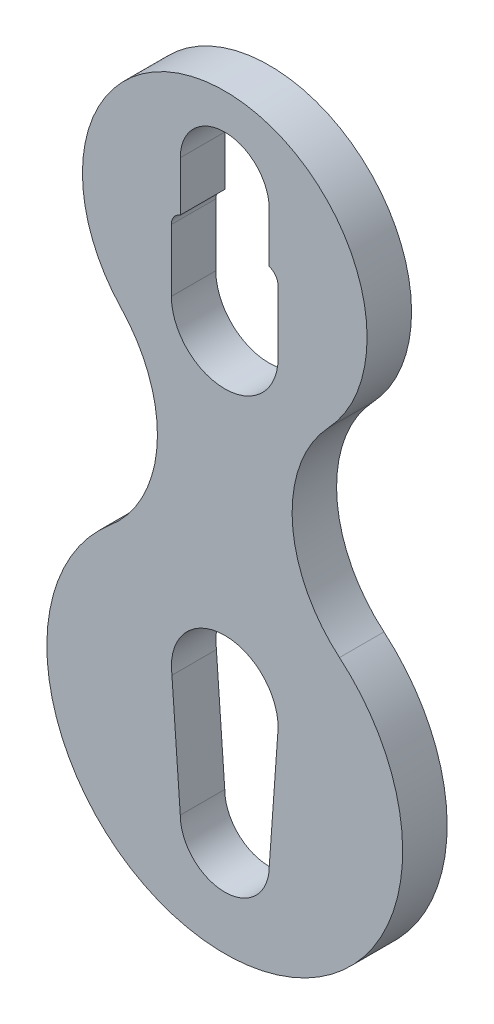
ISO-10303-21;
HEADER;
FILE_DESCRIPTION(('STEP AP214'),'2;1');
FILE_NAME('part.step','',(''),(''),'','','');
FILE_SCHEMA(('AUTOMOTIVE_DESIGN { 1 0 10303 214 1 1 1 1 }'));
ENDSEC;
DATA;
#1=APPLICATION_CONTEXT('core data for automotive mechanical design processes');
#2=APPLICATION_PROTOCOL_DEFINITION('international standard','automotive_design',2000,#1);
#3=PRODUCT_CONTEXT('',#1,'mechanical');
#4=PRODUCT('Part','Part','',(#3));
#5=PRODUCT_RELATED_PRODUCT_CATEGORY('part','',(#4));
#6=PRODUCT_DEFINITION_FORMATION('','',#4);
#7=PRODUCT_DEFINITION_CONTEXT('part definition',#1,'design');
#8=PRODUCT_DEFINITION('design','',#6,#7);
#9=PRODUCT_DEFINITION_SHAPE('','',#8);
#10=(LENGTH_UNIT() NAMED_UNIT(*) SI_UNIT(.MILLI.,.METRE.));
#11=(NAMED_UNIT(*) PLANE_ANGLE_UNIT() SI_UNIT($,.RADIAN.));
#12=(NAMED_UNIT(*) SI_UNIT($,.STERADIAN.) SOLID_ANGLE_UNIT());
#13=UNCERTAINTY_MEASURE_WITH_UNIT(LENGTH_MEASURE(1.E-05),#10,'distance_accuracy_value','');
#14=(GEOMETRIC_REPRESENTATION_CONTEXT(3) GLOBAL_UNCERTAINTY_ASSIGNED_CONTEXT((#13)) GLOBAL_UNIT_ASSIGNED_CONTEXT((#10,
#11,#12)) REPRESENTATION_CONTEXT('',''));
#15=CARTESIAN_POINT('',(0.,0.,0.));
#16=DIRECTION('',(0.,0.,1.));
#17=DIRECTION('',(1.,0.,0.));
#18=AXIS2_PLACEMENT_3D('',#15,#16,#17);
#19=CARTESIAN_POINT('',(0.,-18.,5.));
#20=DIRECTION('',(0.,0.,-1.));
#21=DIRECTION('',(-1.,0.,0.));
#22=AXIS2_PLACEMENT_3D('',#19,#20,#21);
#23=CYLINDRICAL_SURFACE('',#22,10.);
#24=CARTESIAN_POINT('',(0.,-18.,-5.));
#25=DIRECTION('',(0.,0.,1.));
#26=DIRECTION('',(1.,0.,0.));
#27=AXIS2_PLACEMENT_3D('',#24,#25,#26);
#28=CIRCLE('',#27,10.);
#29=CARTESIAN_POINT('',(-10.,-18.,-5.));
#30=VERTEX_POINT('',#29);
#31=CARTESIAN_POINT('',(10.,-18.,-5.));
#32=VERTEX_POINT('',#31);
#33=EDGE_CURVE('E239',#30,#32,#28,.T.);
#34=ORIENTED_EDGE('',*,*,#33,.F.);
#35=DIRECTION('',(0.,0.,-1.));
#36=VECTOR('',#35,1.);
#37=CARTESIAN_POINT('',(-10.,-18.,5.));
#38=LINE('',#37,#36);
#39=CARTESIAN_POINT('',(-10.,-18.,5.));
#40=VERTEX_POINT('',#39);
#41=EDGE_CURVE('E11',#40,#30,#38,.T.);
#42=ORIENTED_EDGE('',*,*,#41,.F.);
#43=CARTESIAN_POINT('',(0.,-18.,5.));
#44=DIRECTION('',(0.,0.,1.));
#45=DIRECTION('',(1.,0.,0.));
#46=AXIS2_PLACEMENT_3D('',#43,#44,#45);
#47=CIRCLE('',#46,10.);
#48=CARTESIAN_POINT('',(10.,-18.,5.));
#49=VERTEX_POINT('',#48);
#50=EDGE_CURVE('E182',#40,#49,#47,.T.);
#51=ORIENTED_EDGE('',*,*,#50,.T.);
#52=DIRECTION('',(0.,0.,-1.));
#53=VECTOR('',#52,1.);
#54=CARTESIAN_POINT('',(10.,-18.,5.));
#55=LINE('',#54,#53);
#56=EDGE_CURVE('E121',#49,#32,#55,.T.);
#57=ORIENTED_EDGE('',*,*,#56,.T.);
#58=EDGE_LOOP('',(#34,#42,#51,#57));
#59=FACE_BOUND('',#58,.T.);
#60=ADVANCED_FACE('F43',(#59),#23,.F.);
#61=CARTESIAN_POINT('',(-11.2284263959391,-0.802030456852792,5.));
#62=DIRECTION('',(0.997458699830735,0.0712470499879096,0.));
#63=DIRECTION('',(-0.0712470499879096,0.997458699830735,0.));
#64=AXIS2_PLACEMENT_3D('',#61,#62,#63);
#65=PLANE('',#64);
#66=DIRECTION('',(0.0712470499879096,-0.997458699830735,0.));
#67=VECTOR('',#66,1.);
#68=CARTESIAN_POINT('',(-11.2284263959391,-0.802030456852792,-5.));
#69=LINE('',#68,#67);
#70=CARTESIAN_POINT('',(-11.8781725888325,8.29441624365486,-5.));
#71=VERTEX_POINT('',#70);
#72=EDGE_CURVE('E173',#71,#30,#69,.T.);
#73=ORIENTED_EDGE('',*,*,#72,.F.);
#74=DIRECTION('',(0.,0.,-1.));
#75=VECTOR('',#74,1.);
#76=CARTESIAN_POINT('',(-11.8781725888325,8.29441624365486,5.));
#77=LINE('',#76,#75);
#78=CARTESIAN_POINT('',(-11.8781725888325,8.29441624365486,5.));
#79=VERTEX_POINT('',#78);
#80=EDGE_CURVE('E54',#79,#71,#77,.T.);
#81=ORIENTED_EDGE('',*,*,#80,.F.);
#82=DIRECTION('',(0.0712470499879096,-0.997458699830735,0.));
#83=VECTOR('',#82,1.);
#84=CARTESIAN_POINT('',(-11.2284263959391,-0.802030456852792,5.));
#85=LINE('',#84,#83);
#86=EDGE_CURVE('E171',#79,#40,#85,.T.);
#87=ORIENTED_EDGE('',*,*,#86,.T.);
#88=ORIENTED_EDGE('',*,*,#41,.T.);
#89=EDGE_LOOP('',(#73,#81,#87,#88));
#90=FACE_BOUND('',#89,.T.);
#91=ADVANCED_FACE('F170',(#90),#65,.T.);
#92=CARTESIAN_POINT('',(0.,10.,5.));
#93=DIRECTION('',(0.,0.,-1.));
#94=DIRECTION('',(-1.,0.,0.));
#95=AXIS2_PLACEMENT_3D('',#92,#93,#94);
#96=CYLINDRICAL_SURFACE('',#95,12.);
#97=CARTESIAN_POINT('',(0.,10.,-5.));
#98=DIRECTION('',(0.,0.,1.));
#99=DIRECTION('',(1.,0.,0.));
#100=AXIS2_PLACEMENT_3D('',#97,#98,#99);
#101=CIRCLE('',#100,12.);
#102=CARTESIAN_POINT('',(11.8781725888325,8.29441624365486,-5.));
#103=VERTEX_POINT('',#102);
#104=EDGE_CURVE('E245',#103,#71,#101,.T.);
#105=ORIENTED_EDGE('',*,*,#104,.F.);
#106=DIRECTION('',(0.,0.,-1.));
#107=VECTOR('',#106,1.);
#108=CARTESIAN_POINT('',(11.8781725888325,8.29441624365486,5.));
#109=LINE('',#108,#107);
#110=CARTESIAN_POINT('',(11.8781725888325,8.29441624365486,5.));
#111=VERTEX_POINT('',#110);
#112=EDGE_CURVE('E114',#111,#103,#109,.T.);
#113=ORIENTED_EDGE('',*,*,#112,.F.);
#114=CARTESIAN_POINT('',(0.,10.,5.));
#115=DIRECTION('',(0.,0.,1.));
#116=DIRECTION('',(1.,0.,0.));
#117=AXIS2_PLACEMENT_3D('',#114,#115,#116);
#118=CIRCLE('',#117,12.);
#119=EDGE_CURVE('E181',#111,#79,#118,.T.);
#120=ORIENTED_EDGE('',*,*,#119,.T.);
#121=ORIENTED_EDGE('',*,*,#80,.T.);
#122=EDGE_LOOP('',(#105,#113,#120,#121));
#123=FACE_BOUND('',#122,.T.);
#124=ADVANCED_FACE('F185',(#123),#96,.F.);
#125=CARTESIAN_POINT('',(9.99999999999998,0.,5.));
#126=DIRECTION('',(1.,0.,0.));
#127=DIRECTION('',(0.,1.,0.));
#128=AXIS2_PLACEMENT_3D('',#125,#126,#127);
#129=PLANE('',#128);
#130=DIRECTION('',(0.,-1.,0.));
#131=VECTOR('',#130,1.);
#132=CARTESIAN_POINT('',(9.99999999999998,0.,-5.));
#133=LINE('',#132,#131);
#134=CARTESIAN_POINT('',(10.,110.,-5.));
#135=VERTEX_POINT('',#134);
#136=CARTESIAN_POINT('',(10.,98.8284271247462,-5.));
#137=VERTEX_POINT('',#136);
#138=EDGE_CURVE('E208',#135,#137,#133,.T.);
#139=ORIENTED_EDGE('',*,*,#138,.T.);
#140=DIRECTION('',(0.,0.,-1.));
#141=VECTOR('',#140,1.);
#142=CARTESIAN_POINT('',(10.,98.8284271247462,5.));
#143=LINE('',#142,#141);
#144=CARTESIAN_POINT('',(10.,98.8284271247462,5.));
#145=VERTEX_POINT('',#144);
#146=EDGE_CURVE('E254',#145,#137,#143,.T.);
#147=ORIENTED_EDGE('',*,*,#146,.F.);
#148=DIRECTION('',(0.,-1.,0.));
#149=VECTOR('',#148,1.);
#150=CARTESIAN_POINT('',(9.99999999999998,0.,5.));
#151=LINE('',#150,#149);
#152=CARTESIAN_POINT('',(10.,110.,5.));
#153=VERTEX_POINT('',#152);
#154=EDGE_CURVE('E540',#153,#145,#151,.T.);
#155=ORIENTED_EDGE('',*,*,#154,.F.);
#156=DIRECTION('',(0.,0.,-1.));
#157=VECTOR('',#156,1.);
#158=CARTESIAN_POINT('',(10.,110.,5.));
#159=LINE('',#158,#157);
#160=EDGE_CURVE('E257',#153,#135,#159,.T.);
#161=ORIENTED_EDGE('',*,*,#160,.T.);
#162=EDGE_LOOP('',(#139,#147,#155,#161));
#163=FACE_BOUND('',#162,.T.);
#164=ADVANCED_FACE('F350',(#163),#129,.F.);
#165=CARTESIAN_POINT('',(9.,96.,5.));
#166=DIRECTION('',(0.,0.,-1.));
#167=DIRECTION('',(-1.,0.,0.));
#168=AXIS2_PLACEMENT_3D('',#165,#166,#167);
#169=CYLINDRICAL_SURFACE('',#168,3.);
#170=CARTESIAN_POINT('',(9.,96.,-5.));
#171=DIRECTION('',(0.,0.,1.));
#172=DIRECTION('',(1.,0.,0.));
#173=AXIS2_PLACEMENT_3D('',#170,#171,#172);
#174=CIRCLE('',#173,3.);
#175=CARTESIAN_POINT('',(12.,96.,-5.));
#176=VERTEX_POINT('',#175);
#177=EDGE_CURVE('E212',#137,#176,#174,.F.);
#178=ORIENTED_EDGE('',*,*,#177,.T.);
#179=DIRECTION('',(0.,0.,-1.));
#180=VECTOR('',#179,1.);
#181=CARTESIAN_POINT('',(12.,96.,5.));
#182=LINE('',#181,#180);
#183=CARTESIAN_POINT('',(12.,96.,5.));
#184=VERTEX_POINT('',#183);
#185=EDGE_CURVE('E275',#184,#176,#182,.T.);
#186=ORIENTED_EDGE('',*,*,#185,.F.);
#187=CARTESIAN_POINT('',(9.,96.,5.));
#188=DIRECTION('',(0.,0.,1.));
#189=DIRECTION('',(1.,0.,0.));
#190=AXIS2_PLACEMENT_3D('',#187,#188,#189);
#191=CIRCLE('',#190,3.);
#192=EDGE_CURVE('E537',#145,#184,#191,.F.);
#193=ORIENTED_EDGE('',*,*,#192,.F.);
#194=ORIENTED_EDGE('',*,*,#146,.T.);
#195=EDGE_LOOP('',(#178,#186,#193,#194));
#196=FACE_BOUND('',#195,.T.);
#197=ADVANCED_FACE('F346',(#196),#169,.F.);
#198=CARTESIAN_POINT('',(12.,0.,5.));
#199=DIRECTION('',(1.,0.,0.));
#200=DIRECTION('',(0.,1.,0.));
#201=AXIS2_PLACEMENT_3D('',#198,#199,#200);
#202=PLANE('',#201);
#203=DIRECTION('',(0.,-1.,0.));
#204=VECTOR('',#203,1.);
#205=CARTESIAN_POINT('',(12.,0.,-5.));
#206=LINE('',#205,#204);
#207=CARTESIAN_POINT('',(12.,82.,-5.));
#208=VERTEX_POINT('',#207);
#209=EDGE_CURVE('E215',#176,#208,#206,.T.);
#210=ORIENTED_EDGE('',*,*,#209,.T.);
#211=DIRECTION('',(0.,0.,-1.));
#212=VECTOR('',#211,1.);
#213=CARTESIAN_POINT('',(12.,82.,5.));
#214=LINE('',#213,#212);
#215=CARTESIAN_POINT('',(12.,82.,5.));
#216=VERTEX_POINT('',#215);
#217=EDGE_CURVE('E272',#216,#208,#214,.T.);
#218=ORIENTED_EDGE('',*,*,#217,.F.);
#219=DIRECTION('',(0.,-1.,0.));
#220=VECTOR('',#219,1.);
#221=CARTESIAN_POINT('',(12.,0.,5.));
#222=LINE('',#221,#220);
#223=EDGE_CURVE('E534',#184,#216,#222,.T.);
#224=ORIENTED_EDGE('',*,*,#223,.F.);
#225=ORIENTED_EDGE('',*,*,#185,.T.);
#226=EDGE_LOOP('',(#210,#218,#224,#225));
#227=FACE_BOUND('',#226,.T.);
#228=ADVANCED_FACE('F342',(#227),#202,.F.);
#229=CARTESIAN_POINT('',(0.,82.,5.));
#230=DIRECTION('',(0.,0.,-1.));
#231=DIRECTION('',(-1.,0.,0.));
#232=AXIS2_PLACEMENT_3D('',#229,#230,#231);
#233=CYLINDRICAL_SURFACE('',#232,12.);
#234=CARTESIAN_POINT('',(0.,82.,-5.));
#235=DIRECTION('',(0.,0.,1.));
#236=DIRECTION('',(1.,0.,0.));
#237=AXIS2_PLACEMENT_3D('',#234,#235,#236);
#238=CIRCLE('',#237,12.);
#239=CARTESIAN_POINT('',(-12.,82.,-5.));
#240=VERTEX_POINT('',#239);
#241=EDGE_CURVE('E219',#240,#208,#238,.T.);
#242=ORIENTED_EDGE('',*,*,#241,.F.);
#243=DIRECTION('',(0.,0.,-1.));
#244=VECTOR('',#243,1.);
#245=CARTESIAN_POINT('',(-12.,82.,5.));
#246=LINE('',#245,#244);
#247=CARTESIAN_POINT('',(-12.,82.,5.));
#248=VERTEX_POINT('',#247);
#249=EDGE_CURVE('E269',#248,#240,#246,.T.);
#250=ORIENTED_EDGE('',*,*,#249,.F.);
#251=CARTESIAN_POINT('',(0.,82.,5.));
#252=DIRECTION('',(0.,0.,1.));
#253=DIRECTION('',(1.,0.,0.));
#254=AXIS2_PLACEMENT_3D('',#251,#252,#253);
#255=CIRCLE('',#254,12.);
#256=EDGE_CURVE('E530',#248,#216,#255,.T.);
#257=ORIENTED_EDGE('',*,*,#256,.T.);
#258=ORIENTED_EDGE('',*,*,#217,.T.);
#259=EDGE_LOOP('',(#242,#250,#257,#258));
#260=FACE_BOUND('',#259,.T.);
#261=ADVANCED_FACE('F338',(#260),#233,.F.);
#262=CARTESIAN_POINT('',(-12.,0.,5.));
#263=DIRECTION('',(1.,0.,0.));
#264=DIRECTION('',(0.,1.,0.));
#265=AXIS2_PLACEMENT_3D('',#262,#263,#264);
#266=PLANE('',#265);
#267=DIRECTION('',(0.,-1.,0.));
#268=VECTOR('',#267,1.);
#269=CARTESIAN_POINT('',(-12.,0.,-5.));
#270=LINE('',#269,#268);
#271=CARTESIAN_POINT('',(-12.,96.,-5.));
#272=VERTEX_POINT('',#271);
#273=EDGE_CURVE('E223',#272,#240,#270,.T.);
#274=ORIENTED_EDGE('',*,*,#273,.F.);
#275=DIRECTION('',(0.,0.,-1.));
#276=VECTOR('',#275,1.);
#277=CARTESIAN_POINT('',(-12.,96.,5.));
#278=LINE('',#277,#276);
#279=CARTESIAN_POINT('',(-12.,96.,5.));
#280=VERTEX_POINT('',#279);
#281=EDGE_CURVE('E266',#280,#272,#278,.T.);
#282=ORIENTED_EDGE('',*,*,#281,.F.);
#283=DIRECTION('',(0.,-1.,0.));
#284=VECTOR('',#283,1.);
#285=CARTESIAN_POINT('',(-12.,0.,5.));
#286=LINE('',#285,#284);
#287=EDGE_CURVE('E526',#280,#248,#286,.T.);
#288=ORIENTED_EDGE('',*,*,#287,.T.);
#289=ORIENTED_EDGE('',*,*,#249,.T.);
#290=EDGE_LOOP('',(#274,#282,#288,#289));
#291=FACE_BOUND('',#290,.T.);
#292=ADVANCED_FACE('F334',(#291),#266,.T.);
#293=CARTESIAN_POINT('',(-9.,96.,5.));
#294=DIRECTION('',(0.,0.,-1.));
#295=DIRECTION('',(-1.,0.,0.));
#296=AXIS2_PLACEMENT_3D('',#293,#294,#295);
#297=CYLINDRICAL_SURFACE('',#296,3.);
#298=CARTESIAN_POINT('',(-9.,96.,-5.));
#299=DIRECTION('',(0.,0.,1.));
#300=DIRECTION('',(1.,0.,0.));
#301=AXIS2_PLACEMENT_3D('',#298,#299,#300);
#302=CIRCLE('',#301,3.);
#303=CARTESIAN_POINT('',(-10.,98.8284271247462,-5.));
#304=VERTEX_POINT('',#303);
#305=EDGE_CURVE('E227',#304,#272,#302,.T.);
#306=ORIENTED_EDGE('',*,*,#305,.F.);
#307=DIRECTION('',(0.,0.,-1.));
#308=VECTOR('',#307,1.);
#309=CARTESIAN_POINT('',(-10.,98.8284271247462,5.));
#310=LINE('',#309,#308);
#311=CARTESIAN_POINT('',(-10.,98.8284271247462,5.));
#312=VERTEX_POINT('',#311);
#313=EDGE_CURVE('E263',#312,#304,#310,.T.);
#314=ORIENTED_EDGE('',*,*,#313,.F.);
#315=CARTESIAN_POINT('',(-9.,96.,5.));
#316=DIRECTION('',(0.,0.,1.));
#317=DIRECTION('',(1.,0.,0.));
#318=AXIS2_PLACEMENT_3D('',#315,#316,#317);
#319=CIRCLE('',#318,3.);
#320=EDGE_CURVE('E522',#312,#280,#319,.T.);
#321=ORIENTED_EDGE('',*,*,#320,.T.);
#322=ORIENTED_EDGE('',*,*,#281,.T.);
#323=EDGE_LOOP('',(#306,#314,#321,#322));
#324=FACE_BOUND('',#323,.T.);
#325=ADVANCED_FACE('F330',(#324),#297,.F.);
#326=CARTESIAN_POINT('',(-9.99999999999998,0.,5.));
#327=DIRECTION('',(1.,0.,0.));
#328=DIRECTION('',(0.,1.,0.));
#329=AXIS2_PLACEMENT_3D('',#326,#327,#328);
#330=PLANE('',#329);
#331=DIRECTION('',(0.,-1.,0.));
#332=VECTOR('',#331,1.);
#333=CARTESIAN_POINT('',(-9.99999999999998,0.,-5.));
#334=LINE('',#333,#332);
#335=CARTESIAN_POINT('',(-10.,110.,-5.));
#336=VERTEX_POINT('',#335);
#337=EDGE_CURVE('E231',#336,#304,#334,.T.);
#338=ORIENTED_EDGE('',*,*,#337,.F.);
#339=DIRECTION('',(0.,0.,-1.));
#340=VECTOR('',#339,1.);
#341=CARTESIAN_POINT('',(-10.,110.,5.));
#342=LINE('',#341,#340);
#343=CARTESIAN_POINT('',(-10.,110.,5.));
#344=VERTEX_POINT('',#343);
#345=EDGE_CURVE('E260',#344,#336,#342,.T.);
#346=ORIENTED_EDGE('',*,*,#345,.F.);
#347=DIRECTION('',(0.,-1.,0.));
#348=VECTOR('',#347,1.);
#349=CARTESIAN_POINT('',(-9.99999999999998,0.,5.));
#350=LINE('',#349,#348);
#351=EDGE_CURVE('E516',#344,#312,#350,.T.);
#352=ORIENTED_EDGE('',*,*,#351,.T.);
#353=ORIENTED_EDGE('',*,*,#313,.T.);
#354=EDGE_LOOP('',(#338,#346,#352,#353));
#355=FACE_BOUND('',#354,.T.);
#356=ADVANCED_FACE('F327',(#355),#330,.T.);
#357=CARTESIAN_POINT('',(0.,96.,5.));
#358=DIRECTION('',(0.,0.,-1.));
#359=DIRECTION('',(-1.,0.,0.));
#360=AXIS2_PLACEMENT_3D('',#357,#358,#359);
#361=CYLINDRICAL_SURFACE('',#360,32.);
#362=CARTESIAN_POINT('',(0.,96.,-5.));
#363=DIRECTION('',(0.,0.,1.));
#364=DIRECTION('',(1.,0.,0.));
#365=AXIS2_PLACEMENT_3D('',#362,#363,#364);
#366=CIRCLE('',#365,32.);
#367=CARTESIAN_POINT('',(23.2988099985067,74.0645161290323,-5.));
#368=VERTEX_POINT('',#367);
#369=CARTESIAN_POINT('',(-23.2988099985067,74.0645161290323,-5.));
#370=VERTEX_POINT('',#369);
#371=EDGE_CURVE('E193',#368,#370,#366,.T.);
#372=ORIENTED_EDGE('',*,*,#371,.T.);
#373=DIRECTION('',(0.,0.,-1.));
#374=VECTOR('',#373,1.);
#375=CARTESIAN_POINT('',(-23.2988099985067,74.0645161290323,5.));
#376=LINE('',#375,#374);
#377=CARTESIAN_POINT('',(-23.2988099985067,74.0645161290323,5.));
#378=VERTEX_POINT('',#377);
#379=EDGE_CURVE('E47',#378,#370,#376,.T.);
#380=ORIENTED_EDGE('',*,*,#379,.F.);
#381=CARTESIAN_POINT('',(0.,96.,5.));
#382=DIRECTION('',(0.,0.,1.));
#383=DIRECTION('',(1.,0.,0.));
#384=AXIS2_PLACEMENT_3D('',#381,#382,#383);
#385=CIRCLE('',#384,32.);
#386=CARTESIAN_POINT('',(23.2988099985067,74.0645161290323,5.));
#387=VERTEX_POINT('',#386);
#388=EDGE_CURVE('E251',#387,#378,#385,.T.);
#389=ORIENTED_EDGE('',*,*,#388,.F.);
#390=DIRECTION('',(0.,0.,-1.));
#391=VECTOR('',#390,1.);
#392=CARTESIAN_POINT('',(23.2988099985067,74.0645161290323,5.));
#393=LINE('',#392,#391);
#394=EDGE_CURVE('E189',#387,#368,#393,.T.);
#395=ORIENTED_EDGE('',*,*,#394,.T.);
#396=EDGE_LOOP('',(#372,#380,#389,#395));
#397=FACE_BOUND('',#396,.T.);
#398=ADVANCED_FACE('F45',(#397),#361,.T.);
#399=CARTESIAN_POINT('',(-45.1414443721067,53.5,5.));
#400=DIRECTION('',(0.,0.,-1.));
#401=DIRECTION('',(-1.,0.,0.));
#402=AXIS2_PLACEMENT_3D('',#399,#400,#401);
#403=CYLINDRICAL_SURFACE('',#402,30.);
#404=CARTESIAN_POINT('',(-45.1414443721067,53.5,-5.));
#405=DIRECTION('',(0.,0.,1.));
#406=DIRECTION('',(1.,0.,0.));
#407=AXIS2_PLACEMENT_3D('',#404,#405,#406);
#408=CIRCLE('',#407,30.);
#409=CARTESIAN_POINT('',(-25.7951110697752,30.5714285714286,-5.));
#410=VERTEX_POINT('',#409);
#411=EDGE_CURVE('E197',#370,#410,#408,.F.);
#412=ORIENTED_EDGE('',*,*,#411,.T.);
#413=DIRECTION('',(0.,0.,-1.));
#414=VECTOR('',#413,1.);
#415=CARTESIAN_POINT('',(-25.7951110697752,30.5714285714286,5.));
#416=LINE('',#415,#414);
#417=CARTESIAN_POINT('',(-25.7951110697752,30.5714285714286,5.));
#418=VERTEX_POINT('',#417);
#419=EDGE_CURVE('E286',#418,#410,#416,.T.);
#420=ORIENTED_EDGE('',*,*,#419,.F.);
#421=CARTESIAN_POINT('',(-45.1414443721067,53.5,5.));
#422=DIRECTION('',(0.,0.,1.));
#423=DIRECTION('',(1.,0.,0.));
#424=AXIS2_PLACEMENT_3D('',#421,#422,#423);
#425=CIRCLE('',#424,30.);
#426=EDGE_CURVE('E129',#378,#418,#425,.F.);
#427=ORIENTED_EDGE('',*,*,#426,.F.);
#428=ORIENTED_EDGE('',*,*,#379,.T.);
#429=EDGE_LOOP('',(#412,#420,#427,#428));
#430=FACE_BOUND('',#429,.T.);
#431=ADVANCED_FACE('F294',(#430),#403,.F.);
#432=CARTESIAN_POINT('',(0.,0.,5.));
#433=DIRECTION('',(0.,0.,-1.));
#434=DIRECTION('',(-1.,0.,0.));
#435=AXIS2_PLACEMENT_3D('',#432,#433,#434);
#436=CYLINDRICAL_SURFACE('',#435,40.);
#437=CARTESIAN_POINT('',(0.,0.,-5.));
#438=DIRECTION('',(0.,0.,1.));
#439=DIRECTION('',(1.,0.,0.));
#440=AXIS2_PLACEMENT_3D('',#437,#438,#439);
#441=CIRCLE('',#440,40.);
#442=CARTESIAN_POINT('',(25.7951110697752,30.5714285714286,-5.));
#443=VERTEX_POINT('',#442);
#444=EDGE_CURVE('E200',#410,#443,#441,.T.);
#445=ORIENTED_EDGE('',*,*,#444,.T.);
#446=DIRECTION('',(0.,0.,-1.));
#447=VECTOR('',#446,1.);
#448=CARTESIAN_POINT('',(25.7951110697752,30.5714285714286,5.));
#449=LINE('',#448,#447);
#450=CARTESIAN_POINT('',(25.7951110697752,30.5714285714286,5.));
#451=VERTEX_POINT('',#450);
#452=EDGE_CURVE('E284',#451,#443,#449,.T.);
#453=ORIENTED_EDGE('',*,*,#452,.F.);
#454=CARTESIAN_POINT('',(0.,0.,5.));
#455=DIRECTION('',(0.,0.,1.));
#456=DIRECTION('',(1.,0.,0.));
#457=AXIS2_PLACEMENT_3D('',#454,#455,#456);
#458=CIRCLE('',#457,40.);
#459=EDGE_CURVE('E546',#418,#451,#458,.T.);
#460=ORIENTED_EDGE('',*,*,#459,.F.);
#461=ORIENTED_EDGE('',*,*,#419,.T.);
#462=EDGE_LOOP('',(#445,#453,#460,#461));
#463=FACE_BOUND('',#462,.T.);
#464=ADVANCED_FACE('F308',(#463),#436,.T.);
#465=CARTESIAN_POINT('',(0.,110.,5.));
#466=DIRECTION('',(0.,0.,-1.));
#467=DIRECTION('',(-1.,0.,0.));
#468=AXIS2_PLACEMENT_3D('',#465,#466,#467);
#469=CYLINDRICAL_SURFACE('',#468,10.);
#470=CARTESIAN_POINT('',(0.,110.,-5.));
#471=DIRECTION('',(0.,0.,1.));
#472=DIRECTION('',(1.,0.,0.));
#473=AXIS2_PLACEMENT_3D('',#470,#471,#472);
#474=CIRCLE('',#473,10.);
#475=EDGE_CURVE('E235',#135,#336,#474,.T.);
#476=ORIENTED_EDGE('',*,*,#475,.F.);
#477=ORIENTED_EDGE('',*,*,#160,.F.);
#478=CARTESIAN_POINT('',(0.,110.,5.));
#479=DIRECTION('',(0.,0.,1.));
#480=DIRECTION('',(1.,0.,0.));
#481=AXIS2_PLACEMENT_3D('',#478,#479,#480);
#482=CIRCLE('',#481,10.);
#483=EDGE_CURVE('E513',#153,#344,#482,.T.);
#484=ORIENTED_EDGE('',*,*,#483,.T.);
#485=ORIENTED_EDGE('',*,*,#345,.T.);
#486=EDGE_LOOP('',(#476,#477,#484,#485));
#487=FACE_BOUND('',#486,.T.);
#488=ADVANCED_FACE('F310',(#487),#469,.F.);
#489=CARTESIAN_POINT('',(45.1414443721067,53.5,5.));
#490=DIRECTION('',(0.,0.,-1.));
#491=DIRECTION('',(-1.,0.,0.));
#492=AXIS2_PLACEMENT_3D('',#489,#490,#491);
#493=CYLINDRICAL_SURFACE('',#492,30.);
#494=CARTESIAN_POINT('',(45.1414443721067,53.5,-5.));
#495=DIRECTION('',(0.,0.,1.));
#496=DIRECTION('',(1.,0.,0.));
#497=AXIS2_PLACEMENT_3D('',#494,#495,#496);
#498=CIRCLE('',#497,30.);
#499=EDGE_CURVE('E204',#368,#443,#498,.T.);
#500=ORIENTED_EDGE('',*,*,#499,.F.);
#501=ORIENTED_EDGE('',*,*,#394,.F.);
#502=CARTESIAN_POINT('',(45.1414443721067,53.5,5.));
#503=DIRECTION('',(0.,0.,1.));
#504=DIRECTION('',(1.,0.,0.));
#505=AXIS2_PLACEMENT_3D('',#502,#503,#504);
#506=CIRCLE('',#505,30.);
#507=EDGE_CURVE('E307',#387,#451,#506,.T.);
#508=ORIENTED_EDGE('',*,*,#507,.T.);
#509=ORIENTED_EDGE('',*,*,#452,.T.);
#510=EDGE_LOOP('',(#500,#501,#508,#509));
#511=FACE_BOUND('',#510,.T.);
#512=ADVANCED_FACE('F303',(#511),#493,.F.);
#513=CARTESIAN_POINT('',(11.2284263959391,-0.802030456852792,5.));
#514=DIRECTION('',(0.997458699830735,-0.0712470499879096,0.));
#515=DIRECTION('',(0.0712470499879096,0.997458699830735,0.));
#516=AXIS2_PLACEMENT_3D('',#513,#514,#515);
#517=PLANE('',#516);
#518=DIRECTION('',(-0.0712470499879096,-0.997458699830735,0.));
#519=VECTOR('',#518,1.);
#520=CARTESIAN_POINT('',(11.2284263959391,-0.802030456852792,-5.));
#521=LINE('',#520,#519);
#522=EDGE_CURVE('E248',#103,#32,#521,.T.);
#523=ORIENTED_EDGE('',*,*,#522,.T.);
#524=ORIENTED_EDGE('',*,*,#56,.F.);
#525=DIRECTION('',(-0.0712470499879096,-0.997458699830735,0.));
#526=VECTOR('',#525,1.);
#527=CARTESIAN_POINT('',(11.2284263959391,-0.802030456852792,5.));
#528=LINE('',#527,#526);
#529=EDGE_CURVE('E63',#111,#49,#528,.T.);
#530=ORIENTED_EDGE('',*,*,#529,.F.);
#531=ORIENTED_EDGE('',*,*,#112,.T.);
#532=EDGE_LOOP('',(#523,#524,#530,#531));
#533=FACE_BOUND('',#532,.T.);
#534=ADVANCED_FACE('F355',(#533),#517,.F.);
#535=CARTESIAN_POINT('',(0.,0.,5.));
#536=DIRECTION('',(0.,0.,1.));
#537=DIRECTION('',(1.,0.,0.));
#538=AXIS2_PLACEMENT_3D('',#535,#536,#537);
#539=PLANE('',#538);
#540=ORIENTED_EDGE('',*,*,#388,.T.);
#541=ORIENTED_EDGE('',*,*,#426,.T.);
#542=ORIENTED_EDGE('',*,*,#459,.T.);
#543=ORIENTED_EDGE('',*,*,#507,.F.);
#544=EDGE_LOOP('',(#540,#541,#542,#543));
#545=FACE_BOUND('',#544,.T.);
#546=ORIENTED_EDGE('',*,*,#154,.T.);
#547=ORIENTED_EDGE('',*,*,#192,.T.);
#548=ORIENTED_EDGE('',*,*,#223,.T.);
#549=ORIENTED_EDGE('',*,*,#256,.F.);
#550=ORIENTED_EDGE('',*,*,#287,.F.);
#551=ORIENTED_EDGE('',*,*,#320,.F.);
#552=ORIENTED_EDGE('',*,*,#351,.F.);
#553=ORIENTED_EDGE('',*,*,#483,.F.);
#554=EDGE_LOOP('',(#546,#547,#548,#549,#550,#551,#552,#553));
#555=FACE_BOUND('',#554,.T.);
#556=ORIENTED_EDGE('',*,*,#50,.F.);
#557=ORIENTED_EDGE('',*,*,#86,.F.);
#558=ORIENTED_EDGE('',*,*,#119,.F.);
#559=ORIENTED_EDGE('',*,*,#529,.T.);
#560=EDGE_LOOP('',(#556,#557,#558,#559));
#561=FACE_BOUND('',#560,.T.);
#562=ADVANCED_FACE('F180',(#545,#555,#561),#539,.T.);
#563=CARTESIAN_POINT('',(0.,0.,-5.));
#564=DIRECTION('',(0.,0.,1.));
#565=DIRECTION('',(1.,0.,0.));
#566=AXIS2_PLACEMENT_3D('',#563,#564,#565);
#567=PLANE('',#566);
#568=ORIENTED_EDGE('',*,*,#371,.F.);
#569=ORIENTED_EDGE('',*,*,#499,.T.);
#570=ORIENTED_EDGE('',*,*,#444,.F.);
#571=ORIENTED_EDGE('',*,*,#411,.F.);
#572=EDGE_LOOP('',(#568,#569,#570,#571));
#573=FACE_BOUND('',#572,.T.);
#574=ORIENTED_EDGE('',*,*,#138,.F.);
#575=ORIENTED_EDGE('',*,*,#475,.T.);
#576=ORIENTED_EDGE('',*,*,#337,.T.);
#577=ORIENTED_EDGE('',*,*,#305,.T.);
#578=ORIENTED_EDGE('',*,*,#273,.T.);
#579=ORIENTED_EDGE('',*,*,#241,.T.);
#580=ORIENTED_EDGE('',*,*,#209,.F.);
#581=ORIENTED_EDGE('',*,*,#177,.F.);
#582=EDGE_LOOP('',(#574,#575,#576,#577,#578,#579,#580,#581));
#583=FACE_BOUND('',#582,.T.);
#584=ORIENTED_EDGE('',*,*,#33,.T.);
#585=ORIENTED_EDGE('',*,*,#522,.F.);
#586=ORIENTED_EDGE('',*,*,#104,.T.);
#587=ORIENTED_EDGE('',*,*,#72,.T.);
#588=EDGE_LOOP('',(#584,#585,#586,#587));
#589=FACE_BOUND('',#588,.T.);
#590=ADVANCED_FACE('F300',(#573,#583,#589),#567,.F.);
#591=CLOSED_SHELL('',(#60,#91,#124,#164,#197,#228,#261,#292,#325,#356,#398,#431,#464,#488,#512,
#534,#562,#590));
#592=MANIFOLD_SOLID_BREP('B2',#591);
#593=ADVANCED_BREP_SHAPE_REPRESENTATION('',(#18,#592),#14);
#594=SHAPE_DEFINITION_REPRESENTATION(#9,#593);
ENDSEC;
END-ISO-10303-21;
